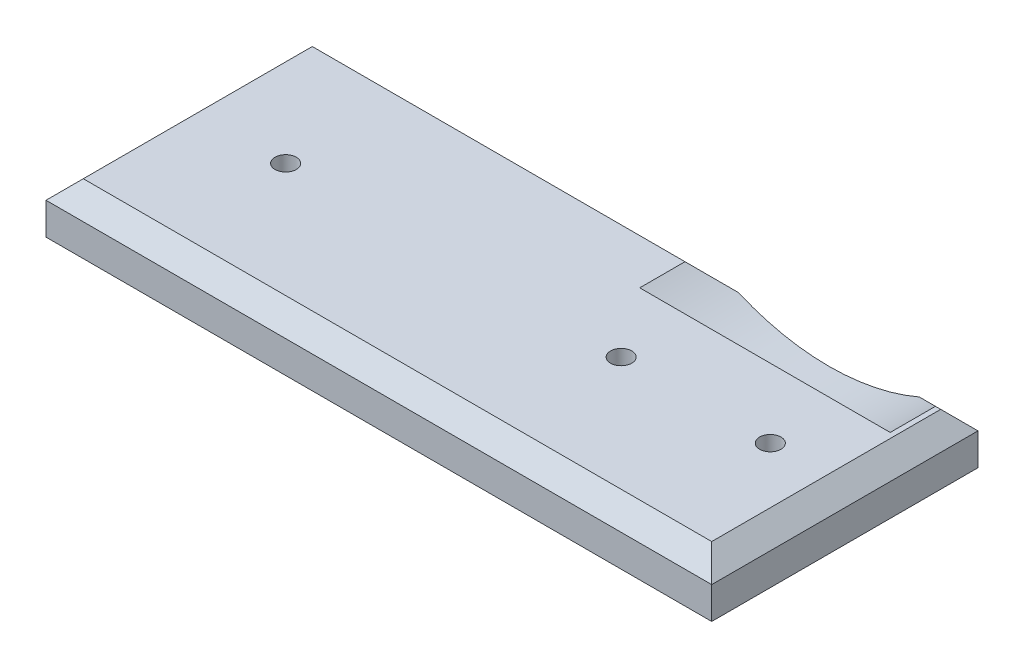
ISO-10303-21;
HEADER;
FILE_DESCRIPTION(('STEP AP214'),'2;1');
FILE_NAME('part.step','',(''),(''),'','','');
FILE_SCHEMA(('AUTOMOTIVE_DESIGN { 1 0 10303 214 1 1 1 1 }'));
ENDSEC;
DATA;
#1=APPLICATION_CONTEXT('core data for automotive mechanical design processes');
#2=APPLICATION_PROTOCOL_DEFINITION('international standard','automotive_design',2000,#1);
#3=PRODUCT_CONTEXT('',#1,'mechanical');
#4=PRODUCT('Part','Part','',(#3));
#5=PRODUCT_RELATED_PRODUCT_CATEGORY('part','',(#4));
#6=PRODUCT_DEFINITION_FORMATION('','',#4);
#7=PRODUCT_DEFINITION_CONTEXT('part definition',#1,'design');
#8=PRODUCT_DEFINITION('design','',#6,#7);
#9=PRODUCT_DEFINITION_SHAPE('','',#8);
#10=(LENGTH_UNIT() NAMED_UNIT(*) SI_UNIT(.MILLI.,.METRE.));
#11=(NAMED_UNIT(*) PLANE_ANGLE_UNIT() SI_UNIT($,.RADIAN.));
#12=(NAMED_UNIT(*) SI_UNIT($,.STERADIAN.) SOLID_ANGLE_UNIT());
#13=UNCERTAINTY_MEASURE_WITH_UNIT(LENGTH_MEASURE(1.E-05),#10,'distance_accuracy_value','');
#14=(GEOMETRIC_REPRESENTATION_CONTEXT(3) GLOBAL_UNCERTAINTY_ASSIGNED_CONTEXT((#13)) GLOBAL_UNIT_ASSIGNED_CONTEXT((#10,
#11,#12)) REPRESENTATION_CONTEXT('',''));
#15=CARTESIAN_POINT('',(0.,0.,0.));
#16=DIRECTION('',(0.,0.,1.));
#17=DIRECTION('',(1.,0.,0.));
#18=AXIS2_PLACEMENT_3D('',#15,#16,#17);
#19=CARTESIAN_POINT('',(0.,9.5,-21.5));
#20=DIRECTION('',(0.,0.707106781186546,-0.707106781186549));
#21=DIRECTION('',(1.,0.,0.));
#22=AXIS2_PLACEMENT_3D('',#19,#20,#21);
#23=PLANE('',#22);
#24=CARTESIAN_POINT('',(34.5,45.5,14.4999999999998));
#25=DIRECTION('',(0.,0.707106781186546,-0.707106781186549));
#26=DIRECTION('',(0.,-0.707106781186549,-0.707106781186546));
#27=AXIS2_PLACEMENT_3D('',#24,#25,#26);
#28=ELLIPSE('',#27,60.811183182043,43.);
#29=CARTESIAN_POINT('',(17.5073545320336,6.00000000000001,-25.));
#30=VERTEX_POINT('',#29);
#31=CARTESIAN_POINT('',(10.9840479673903,9.5,-21.5));
#32=VERTEX_POINT('',#31);
#33=EDGE_CURVE('E52',#30,#32,#28,.T.);
#34=ORIENTED_EDGE('',*,*,#33,.F.);
#35=DIRECTION('',(1.,0.,0.));
#36=VECTOR('',#35,1.);
#37=CARTESIAN_POINT('',(62.5,6.00000000000001,-25.));
#38=LINE('',#37,#36);
#39=CARTESIAN_POINT('',(-62.5,6.00000000000001,-25.));
#40=VERTEX_POINT('',#39);
#41=EDGE_CURVE('E131',#40,#30,#38,.T.);
#42=ORIENTED_EDGE('',*,*,#41,.F.);
#43=DIRECTION('',(0.577350269189625,0.577350269189627,0.577350269189625));
#44=VECTOR('',#43,1.);
#45=CARTESIAN_POINT('',(-39.3333333333334,29.1666666666667,-1.8333333333334));
#46=LINE('',#45,#44);
#47=CARTESIAN_POINT('',(-59.,9.5,-21.5));
#48=VERTEX_POINT('',#47);
#49=EDGE_CURVE('E157',#48,#40,#46,.F.);
#50=ORIENTED_EDGE('',*,*,#49,.F.);
#51=DIRECTION('',(-1.,0.,0.));
#52=VECTOR('',#51,1.);
#53=CARTESIAN_POINT('',(-62.5,9.5,-21.5));
#54=LINE('',#53,#52);
#55=EDGE_CURVE('E207',#32,#48,#54,.T.);
#56=ORIENTED_EDGE('',*,*,#55,.F.);
#57=EDGE_LOOP('',(#34,#42,#50,#56));
#58=FACE_BOUND('',#57,.T.);
#59=ADVANCED_FACE('F42',(#58),#23,.T.);
#60=CARTESIAN_POINT('',(62.5,9.5,-25.));
#61=DIRECTION('',(-1.,0.,0.));
#62=DIRECTION('',(0.,0.,1.));
#63=AXIS2_PLACEMENT_3D('',#60,#61,#62);
#64=PLANE('',#63);
#65=DIRECTION('',(0.,-1.,0.));
#66=VECTOR('',#65,1.);
#67=CARTESIAN_POINT('',(62.5,9.5,-25.));
#68=LINE('',#67,#66);
#69=CARTESIAN_POINT('',(62.5,6.00000000000001,-25.));
#70=VERTEX_POINT('',#69);
#71=CARTESIAN_POINT('',(62.5,0.,-25.));
#72=VERTEX_POINT('',#71);
#73=EDGE_CURVE('E198',#70,#72,#68,.T.);
#74=ORIENTED_EDGE('',*,*,#73,.F.);
#75=DIRECTION('',(0.,0.,1.));
#76=VECTOR('',#75,1.);
#77=CARTESIAN_POINT('',(62.5,6.00000000000001,25.));
#78=LINE('',#77,#76);
#79=CARTESIAN_POINT('',(62.5,6.00000000000001,25.));
#80=VERTEX_POINT('',#79);
#81=EDGE_CURVE('E67',#70,#80,#78,.T.);
#82=ORIENTED_EDGE('',*,*,#81,.T.);
#83=DIRECTION('',(0.,-1.,0.));
#84=VECTOR('',#83,1.);
#85=CARTESIAN_POINT('',(62.5,9.5,25.));
#86=LINE('',#85,#84);
#87=CARTESIAN_POINT('',(62.5,0.,25.));
#88=VERTEX_POINT('',#87);
#89=EDGE_CURVE('E189',#80,#88,#86,.T.);
#90=ORIENTED_EDGE('',*,*,#89,.T.);
#91=DIRECTION('',(0.,0.,-1.));
#92=VECTOR('',#91,1.);
#93=CARTESIAN_POINT('',(62.5,0.,-25.));
#94=LINE('',#93,#92);
#95=EDGE_CURVE('E166',#88,#72,#94,.T.);
#96=ORIENTED_EDGE('',*,*,#95,.T.);
#97=EDGE_LOOP('',(#74,#82,#90,#96));
#98=FACE_BOUND('',#97,.T.);
#99=ADVANCED_FACE('F305',(#98),#64,.F.);
#100=CARTESIAN_POINT('',(-62.5,9.5,-25.));
#101=DIRECTION('',(0.,0.,1.));
#102=DIRECTION('',(1.,0.,0.));
#103=AXIS2_PLACEMENT_3D('',#100,#101,#102);
#104=PLANE('',#103);
#105=ORIENTED_EDGE('',*,*,#41,.T.);
#106=CARTESIAN_POINT('',(34.5,45.5,-25.));
#107=DIRECTION('',(0.,0.,-1.));
#108=DIRECTION('',(-1.,0.,0.));
#109=AXIS2_PLACEMENT_3D('',#106,#107,#108);
#110=CIRCLE('',#109,43.);
#111=CARTESIAN_POINT('',(51.4926454679664,6.00000000000001,-25.));
#112=VERTEX_POINT('',#111);
#113=EDGE_CURVE('E117',#112,#30,#110,.T.);
#114=ORIENTED_EDGE('',*,*,#113,.F.);
#115=EDGE_CURVE('E128',#112,#70,#38,.T.);
#116=ORIENTED_EDGE('',*,*,#115,.T.);
#117=ORIENTED_EDGE('',*,*,#73,.T.);
#118=DIRECTION('',(-1.,0.,0.));
#119=VECTOR('',#118,1.);
#120=CARTESIAN_POINT('',(-62.5,0.,-25.));
#121=LINE('',#120,#119);
#122=CARTESIAN_POINT('',(-62.5,0.,-25.));
#123=VERTEX_POINT('',#122);
#124=EDGE_CURVE('E170',#72,#123,#121,.T.);
#125=ORIENTED_EDGE('',*,*,#124,.T.);
#126=DIRECTION('',(0.,-1.,0.));
#127=VECTOR('',#126,1.);
#128=CARTESIAN_POINT('',(-62.5,9.5,-25.));
#129=LINE('',#128,#127);
#130=EDGE_CURVE('E195',#40,#123,#129,.T.);
#131=ORIENTED_EDGE('',*,*,#130,.F.);
#132=EDGE_LOOP('',(#105,#114,#116,#117,#125,#131));
#133=FACE_BOUND('',#132,.T.);
#134=ADVANCED_FACE('F127',(#133),#104,.F.);
#135=CARTESIAN_POINT('',(-62.5,9.5,-25.));
#136=DIRECTION('',(1.,0.,0.));
#137=DIRECTION('',(0.,0.,-1.));
#138=AXIS2_PLACEMENT_3D('',#135,#136,#137);
#139=PLANE('',#138);
#140=DIRECTION('',(0.,-1.,0.));
#141=VECTOR('',#140,1.);
#142=CARTESIAN_POINT('',(-62.5,9.5,25.));
#143=LINE('',#142,#141);
#144=CARTESIAN_POINT('',(-62.5,6.00000000000001,25.));
#145=VERTEX_POINT('',#144);
#146=CARTESIAN_POINT('',(-62.5,0.,25.));
#147=VERTEX_POINT('',#146);
#148=EDGE_CURVE('E192',#145,#147,#143,.T.);
#149=ORIENTED_EDGE('',*,*,#148,.F.);
#150=DIRECTION('',(0.,0.,-1.));
#151=VECTOR('',#150,1.);
#152=CARTESIAN_POINT('',(-62.5,6.00000000000001,-25.));
#153=LINE('',#152,#151);
#154=EDGE_CURVE('E140',#145,#40,#153,.T.);
#155=ORIENTED_EDGE('',*,*,#154,.T.);
#156=ORIENTED_EDGE('',*,*,#130,.T.);
#157=DIRECTION('',(0.,0.,1.));
#158=VECTOR('',#157,1.);
#159=CARTESIAN_POINT('',(-62.5,0.,-25.));
#160=LINE('',#159,#158);
#161=EDGE_CURVE('E176',#123,#147,#160,.T.);
#162=ORIENTED_EDGE('',*,*,#161,.T.);
#163=EDGE_LOOP('',(#149,#155,#156,#162));
#164=FACE_BOUND('',#163,.T.);
#165=ADVANCED_FACE('F334',(#164),#139,.F.);
#166=CARTESIAN_POINT('',(-62.5,9.5,25.));
#167=DIRECTION('',(0.,0.,-1.));
#168=DIRECTION('',(-1.,0.,0.));
#169=AXIS2_PLACEMENT_3D('',#166,#167,#168);
#170=PLANE('',#169);
#171=ORIENTED_EDGE('',*,*,#89,.F.);
#172=DIRECTION('',(-1.,0.,0.));
#173=VECTOR('',#172,1.);
#174=CARTESIAN_POINT('',(-62.5,6.00000000000001,25.));
#175=LINE('',#174,#173);
#176=EDGE_CURVE('E124',#80,#145,#175,.T.);
#177=ORIENTED_EDGE('',*,*,#176,.T.);
#178=ORIENTED_EDGE('',*,*,#148,.T.);
#179=DIRECTION('',(1.,0.,0.));
#180=VECTOR('',#179,1.);
#181=CARTESIAN_POINT('',(-62.5,0.,25.));
#182=LINE('',#181,#180);
#183=EDGE_CURVE('E185',#147,#88,#182,.T.);
#184=ORIENTED_EDGE('',*,*,#183,.T.);
#185=EDGE_LOOP('',(#171,#177,#178,#184));
#186=FACE_BOUND('',#185,.T.);
#187=ADVANCED_FACE('F327',(#186),#170,.F.);
#188=CARTESIAN_POINT('',(0.,9.5,0.));
#189=DIRECTION('',(0.,1.,0.));
#190=DIRECTION('',(0.,0.,1.));
#191=AXIS2_PLACEMENT_3D('',#188,#189,#190);
#192=PLANE('',#191);
#193=DIRECTION('',(0.,0.,-1.));
#194=VECTOR('',#193,1.);
#195=CARTESIAN_POINT('',(58.0159520326097,9.5,-13.));
#196=LINE('',#195,#194);
#197=CARTESIAN_POINT('',(58.0159520326097,9.5,-13.));
#198=VERTEX_POINT('',#197);
#199=CARTESIAN_POINT('',(58.0159520326097,9.5,-21.5));
#200=VERTEX_POINT('',#199);
#201=EDGE_CURVE('E59',#198,#200,#196,.T.);
#202=ORIENTED_EDGE('',*,*,#201,.F.);
#203=DIRECTION('',(-1.,0.,0.));
#204=VECTOR('',#203,1.);
#205=CARTESIAN_POINT('',(0.,9.5,-13.));
#206=LINE('',#205,#204);
#207=CARTESIAN_POINT('',(10.9840479673903,9.5,-13.));
#208=VERTEX_POINT('',#207);
#209=EDGE_CURVE('E11',#198,#208,#206,.T.);
#210=ORIENTED_EDGE('',*,*,#209,.T.);
#211=DIRECTION('',(0.,0.,-1.));
#212=VECTOR('',#211,1.);
#213=CARTESIAN_POINT('',(10.9840479673903,9.5,-13.));
#214=LINE('',#213,#212);
#215=EDGE_CURVE('E232',#32,#208,#214,.F.);
#216=ORIENTED_EDGE('',*,*,#215,.F.);
#217=ORIENTED_EDGE('',*,*,#55,.T.);
#218=DIRECTION('',(0.,0.,1.));
#219=VECTOR('',#218,1.);
#220=CARTESIAN_POINT('',(-59.,9.5,25.));
#221=LINE('',#220,#219);
#222=CARTESIAN_POINT('',(-59.,9.5,21.5));
#223=VERTEX_POINT('',#222);
#224=EDGE_CURVE('E146',#48,#223,#221,.T.);
#225=ORIENTED_EDGE('',*,*,#224,.T.);
#226=DIRECTION('',(1.,0.,0.));
#227=VECTOR('',#226,1.);
#228=CARTESIAN_POINT('',(62.5,9.5,21.5));
#229=LINE('',#228,#227);
#230=CARTESIAN_POINT('',(59.,9.5,21.5));
#231=VERTEX_POINT('',#230);
#232=EDGE_CURVE('E201',#223,#231,#229,.T.);
#233=ORIENTED_EDGE('',*,*,#232,.T.);
#234=DIRECTION('',(0.,0.,-1.));
#235=VECTOR('',#234,1.);
#236=CARTESIAN_POINT('',(59.,9.5,-25.));
#237=LINE('',#236,#235);
#238=CARTESIAN_POINT('',(59.,9.5,-21.5));
#239=VERTEX_POINT('',#238);
#240=EDGE_CURVE('E204',#231,#239,#237,.T.);
#241=ORIENTED_EDGE('',*,*,#240,.T.);
#242=EDGE_CURVE('E208',#239,#200,#54,.T.);
#243=ORIENTED_EDGE('',*,*,#242,.T.);
#244=EDGE_LOOP('',(#202,#210,#216,#217,#225,#233,#241,#243));
#245=FACE_BOUND('',#244,.T.);
#246=CARTESIAN_POINT('',(-42.5,9.5,0.));
#247=DIRECTION('',(0.,-1.,0.));
#248=DIRECTION('',(0.,0.,-1.));
#249=AXIS2_PLACEMENT_3D('',#246,#247,#248);
#250=CIRCLE('',#249,2.);
#251=CARTESIAN_POINT('',(-42.5,9.5,-2.));
#252=VERTEX_POINT('',#251);
#253=EDGE_CURVE('E242',#252,#252,#250,.T.);
#254=ORIENTED_EDGE('',*,*,#253,.T.);
#255=EDGE_LOOP('',(#254));
#256=FACE_BOUND('',#255,.T.);
#257=CARTESIAN_POINT('',(20.5,9.5,0.));
#258=DIRECTION('',(0.,-1.,0.));
#259=DIRECTION('',(0.,0.,-1.));
#260=AXIS2_PLACEMENT_3D('',#257,#258,#259);
#261=CIRCLE('',#260,2.);
#262=CARTESIAN_POINT('',(20.5,9.5,-2.));
#263=VERTEX_POINT('',#262);
#264=EDGE_CURVE('E254',#263,#263,#261,.T.);
#265=ORIENTED_EDGE('',*,*,#264,.T.);
#266=EDGE_LOOP('',(#265));
#267=FACE_BOUND('',#266,.T.);
#268=CARTESIAN_POINT('',(48.5,9.5,0.));
#269=DIRECTION('',(0.,-1.,0.));
#270=DIRECTION('',(0.,0.,-1.));
#271=AXIS2_PLACEMENT_3D('',#268,#269,#270);
#272=CIRCLE('',#271,2.);
#273=CARTESIAN_POINT('',(48.5,9.5,-2.));
#274=VERTEX_POINT('',#273);
#275=EDGE_CURVE('E237',#274,#274,#272,.T.);
#276=ORIENTED_EDGE('',*,*,#275,.T.);
#277=EDGE_LOOP('',(#276));
#278=FACE_BOUND('',#277,.T.);
#279=ADVANCED_FACE('F215',(#245,#256,#267,#278),#192,.T.);
#280=CARTESIAN_POINT('',(0.,0.,0.));
#281=DIRECTION('',(0.,1.,0.));
#282=DIRECTION('',(0.,0.,1.));
#283=AXIS2_PLACEMENT_3D('',#280,#281,#282);
#284=PLANE('',#283);
#285=CARTESIAN_POINT('',(-42.5,0.,0.));
#286=DIRECTION('',(0.,-1.,0.));
#287=DIRECTION('',(0.,0.,-1.));
#288=AXIS2_PLACEMENT_3D('',#285,#286,#287);
#289=CIRCLE('',#288,4.);
#290=CARTESIAN_POINT('',(-42.5,0.,-4.));
#291=VERTEX_POINT('',#290);
#292=EDGE_CURVE('E268',#291,#291,#289,.T.);
#293=ORIENTED_EDGE('',*,*,#292,.F.);
#294=EDGE_LOOP('',(#293));
#295=FACE_BOUND('',#294,.T.);
#296=CARTESIAN_POINT('',(20.5,0.,0.));
#297=DIRECTION('',(0.,-1.,0.));
#298=DIRECTION('',(0.,0.,-1.));
#299=AXIS2_PLACEMENT_3D('',#296,#297,#298);
#300=CIRCLE('',#299,4.);
#301=CARTESIAN_POINT('',(20.5,0.,-4.));
#302=VERTEX_POINT('',#301);
#303=EDGE_CURVE('E272',#302,#302,#300,.T.);
#304=ORIENTED_EDGE('',*,*,#303,.F.);
#305=EDGE_LOOP('',(#304));
#306=FACE_BOUND('',#305,.T.);
#307=CARTESIAN_POINT('',(48.5,0.,0.));
#308=DIRECTION('',(0.,-1.,0.));
#309=DIRECTION('',(0.,0.,-1.));
#310=AXIS2_PLACEMENT_3D('',#307,#308,#309);
#311=CIRCLE('',#310,4.00000000000001);
#312=CARTESIAN_POINT('',(48.5,0.,-4.00000000000001));
#313=VERTEX_POINT('',#312);
#314=EDGE_CURVE('E279',#313,#313,#311,.T.);
#315=ORIENTED_EDGE('',*,*,#314,.F.);
#316=EDGE_LOOP('',(#315));
#317=FACE_BOUND('',#316,.T.);
#318=ORIENTED_EDGE('',*,*,#95,.F.);
#319=ORIENTED_EDGE('',*,*,#183,.F.);
#320=ORIENTED_EDGE('',*,*,#161,.F.);
#321=ORIENTED_EDGE('',*,*,#124,.F.);
#322=EDGE_LOOP('',(#318,#319,#320,#321));
#323=FACE_BOUND('',#322,.T.);
#324=ADVANCED_FACE('F318',(#295,#306,#317,#323),#284,.F.);
#325=CARTESIAN_POINT('',(59.,9.5,0.));
#326=DIRECTION('',(0.707106781186549,0.707106781186546,0.));
#327=DIRECTION('',(0.,0.,1.));
#328=AXIS2_PLACEMENT_3D('',#325,#326,#327);
#329=PLANE('',#328);
#330=DIRECTION('',(-0.577350269189625,0.577350269189627,-0.577350269189625));
#331=VECTOR('',#330,1.);
#332=CARTESIAN_POINT('',(39.3333333333334,29.1666666666667,1.83333333333341));
#333=LINE('',#332,#331);
#334=EDGE_CURVE('E161',#80,#231,#333,.T.);
#335=ORIENTED_EDGE('',*,*,#334,.F.);
#336=ORIENTED_EDGE('',*,*,#81,.F.);
#337=DIRECTION('',(-0.577350269189625,0.577350269189627,0.577350269189625));
#338=VECTOR('',#337,1.);
#339=CARTESIAN_POINT('',(51.8333333333334,16.6666666666667,-14.3333333333334));
#340=LINE('',#339,#338);
#341=EDGE_CURVE('E138',#239,#70,#340,.F.);
#342=ORIENTED_EDGE('',*,*,#341,.F.);
#343=ORIENTED_EDGE('',*,*,#240,.F.);
#344=EDGE_LOOP('',(#335,#336,#342,#343));
#345=FACE_BOUND('',#344,.T.);
#346=ADVANCED_FACE('F45',(#345),#329,.T.);
#347=EDGE_CURVE('E114',#200,#112,#28,.T.);
#348=ORIENTED_EDGE('',*,*,#347,.F.);
#349=ORIENTED_EDGE('',*,*,#242,.F.);
#350=ORIENTED_EDGE('',*,*,#341,.T.);
#351=ORIENTED_EDGE('',*,*,#115,.F.);
#352=EDGE_LOOP('',(#348,#349,#350,#351));
#353=FACE_BOUND('',#352,.T.);
#354=ADVANCED_FACE('F136',(#353),#23,.T.);
#355=CARTESIAN_POINT('',(0.,9.5,21.5));
#356=DIRECTION('',(0.,0.707106781186546,0.707106781186549));
#357=DIRECTION('',(-1.,0.,0.));
#358=AXIS2_PLACEMENT_3D('',#355,#356,#357);
#359=PLANE('',#358);
#360=ORIENTED_EDGE('',*,*,#334,.T.);
#361=ORIENTED_EDGE('',*,*,#232,.F.);
#362=DIRECTION('',(-0.577350269189625,-0.577350269189627,0.577350269189625));
#363=VECTOR('',#362,1.);
#364=CARTESIAN_POINT('',(-39.3333333333334,29.1666666666667,1.83333333333341));
#365=LINE('',#364,#363);
#366=EDGE_CURVE('E154',#145,#223,#365,.F.);
#367=ORIENTED_EDGE('',*,*,#366,.F.);
#368=ORIENTED_EDGE('',*,*,#176,.F.);
#369=EDGE_LOOP('',(#360,#361,#367,#368));
#370=FACE_BOUND('',#369,.T.);
#371=ADVANCED_FACE('F228',(#370),#359,.T.);
#372=CARTESIAN_POINT('',(-59.,9.5,0.));
#373=DIRECTION('',(-0.707106781186549,0.707106781186546,0.));
#374=DIRECTION('',(0.,0.,-1.));
#375=AXIS2_PLACEMENT_3D('',#372,#373,#374);
#376=PLANE('',#375);
#377=ORIENTED_EDGE('',*,*,#49,.T.);
#378=ORIENTED_EDGE('',*,*,#154,.F.);
#379=ORIENTED_EDGE('',*,*,#366,.T.);
#380=ORIENTED_EDGE('',*,*,#224,.F.);
#381=EDGE_LOOP('',(#377,#378,#379,#380));
#382=FACE_BOUND('',#381,.T.);
#383=ADVANCED_FACE('F223',(#382),#376,.T.);
#384=CARTESIAN_POINT('',(48.5,4.,0.));
#385=DIRECTION('',(0.,-1.,0.));
#386=DIRECTION('',(0.,0.,-1.));
#387=AXIS2_PLACEMENT_3D('',#384,#385,#386);
#388=CYLINDRICAL_SURFACE('',#387,4.00000000000001);
#389=CARTESIAN_POINT('',(48.5,4.,0.));
#390=DIRECTION('',(0.,-1.,0.));
#391=DIRECTION('',(0.,0.,-1.));
#392=AXIS2_PLACEMENT_3D('',#389,#390,#391);
#393=CIRCLE('',#392,4.00000000000001);
#394=CARTESIAN_POINT('',(48.5,4.,-4.00000000000001));
#395=VERTEX_POINT('',#394);
#396=EDGE_CURVE('E179',#395,#395,#393,.T.);
#397=ORIENTED_EDGE('',*,*,#396,.F.);
#398=EDGE_LOOP('',(#397));
#399=FACE_BOUND('',#398,.T.);
#400=ORIENTED_EDGE('',*,*,#314,.T.);
#401=EDGE_LOOP('',(#400));
#402=FACE_BOUND('',#401,.T.);
#403=ADVANCED_FACE('F292',(#399,#402),#388,.F.);
#404=CARTESIAN_POINT('',(48.5,4.,0.));
#405=DIRECTION('',(0.,-1.,0.));
#406=DIRECTION('',(0.,0.,-1.));
#407=AXIS2_PLACEMENT_3D('',#404,#405,#406);
#408=PLANE('',#407);
#409=CARTESIAN_POINT('',(48.5,4.,0.));
#410=DIRECTION('',(0.,-1.,0.));
#411=DIRECTION('',(0.,0.,-1.));
#412=AXIS2_PLACEMENT_3D('',#409,#410,#411);
#413=CIRCLE('',#412,2.);
#414=CARTESIAN_POINT('',(48.5,4.,-2.));
#415=VERTEX_POINT('',#414);
#416=EDGE_CURVE('E258',#415,#415,#413,.T.);
#417=ORIENTED_EDGE('',*,*,#416,.F.);
#418=EDGE_LOOP('',(#417));
#419=FACE_BOUND('',#418,.T.);
#420=ORIENTED_EDGE('',*,*,#396,.T.);
#421=EDGE_LOOP('',(#420));
#422=FACE_BOUND('',#421,.T.);
#423=ADVANCED_FACE('F290',(#419,#422),#408,.T.);
#424=CARTESIAN_POINT('',(20.5,4.,0.));
#425=DIRECTION('',(0.,-1.,0.));
#426=DIRECTION('',(0.,0.,-1.));
#427=AXIS2_PLACEMENT_3D('',#424,#425,#426);
#428=CYLINDRICAL_SURFACE('',#427,4.);
#429=CARTESIAN_POINT('',(20.5,4.,0.));
#430=DIRECTION('',(0.,-1.,0.));
#431=DIRECTION('',(0.,0.,-1.));
#432=AXIS2_PLACEMENT_3D('',#429,#430,#431);
#433=CIRCLE('',#432,4.);
#434=CARTESIAN_POINT('',(20.5,4.,-4.));
#435=VERTEX_POINT('',#434);
#436=EDGE_CURVE('E276',#435,#435,#433,.T.);
#437=ORIENTED_EDGE('',*,*,#436,.F.);
#438=EDGE_LOOP('',(#437));
#439=FACE_BOUND('',#438,.T.);
#440=ORIENTED_EDGE('',*,*,#303,.T.);
#441=EDGE_LOOP('',(#440));
#442=FACE_BOUND('',#441,.T.);
#443=ADVANCED_FACE('F299',(#439,#442),#428,.F.);
#444=CARTESIAN_POINT('',(20.5,4.,0.));
#445=DIRECTION('',(0.,-1.,0.));
#446=DIRECTION('',(0.,0.,-1.));
#447=AXIS2_PLACEMENT_3D('',#444,#445,#446);
#448=PLANE('',#447);
#449=CARTESIAN_POINT('',(20.5,4.,0.));
#450=DIRECTION('',(0.,-1.,0.));
#451=DIRECTION('',(0.,0.,-1.));
#452=AXIS2_PLACEMENT_3D('',#449,#450,#451);
#453=CIRCLE('',#452,2.);
#454=CARTESIAN_POINT('',(20.5,4.,-2.));
#455=VERTEX_POINT('',#454);
#456=EDGE_CURVE('E250',#455,#455,#453,.T.);
#457=ORIENTED_EDGE('',*,*,#456,.F.);
#458=EDGE_LOOP('',(#457));
#459=FACE_BOUND('',#458,.T.);
#460=ORIENTED_EDGE('',*,*,#436,.T.);
#461=EDGE_LOOP('',(#460));
#462=FACE_BOUND('',#461,.T.);
#463=ADVANCED_FACE('F413',(#459,#462),#448,.T.);
#464=CARTESIAN_POINT('',(-42.5,4.,0.));
#465=DIRECTION('',(0.,-1.,0.));
#466=DIRECTION('',(0.,0.,-1.));
#467=AXIS2_PLACEMENT_3D('',#464,#465,#466);
#468=CYLINDRICAL_SURFACE('',#467,4.);
#469=CARTESIAN_POINT('',(-42.5,4.,0.));
#470=DIRECTION('',(0.,-1.,0.));
#471=DIRECTION('',(0.,0.,-1.));
#472=AXIS2_PLACEMENT_3D('',#469,#470,#471);
#473=CIRCLE('',#472,4.);
#474=CARTESIAN_POINT('',(-42.5,4.,-4.));
#475=VERTEX_POINT('',#474);
#476=EDGE_CURVE('E158',#475,#475,#473,.T.);
#477=ORIENTED_EDGE('',*,*,#476,.F.);
#478=EDGE_LOOP('',(#477));
#479=FACE_BOUND('',#478,.T.);
#480=ORIENTED_EDGE('',*,*,#292,.T.);
#481=EDGE_LOOP('',(#480));
#482=FACE_BOUND('',#481,.T.);
#483=ADVANCED_FACE('F423',(#479,#482),#468,.F.);
#484=CARTESIAN_POINT('',(-42.5,4.,0.));
#485=DIRECTION('',(0.,-1.,0.));
#486=DIRECTION('',(0.,0.,-1.));
#487=AXIS2_PLACEMENT_3D('',#484,#485,#486);
#488=PLANE('',#487);
#489=CARTESIAN_POINT('',(-42.5,4.,0.));
#490=DIRECTION('',(0.,-1.,0.));
#491=DIRECTION('',(0.,0.,-1.));
#492=AXIS2_PLACEMENT_3D('',#489,#490,#491);
#493=CIRCLE('',#492,2.);
#494=CARTESIAN_POINT('',(-42.5,4.,-2.));
#495=VERTEX_POINT('',#494);
#496=EDGE_CURVE('E246',#495,#495,#493,.T.);
#497=ORIENTED_EDGE('',*,*,#496,.F.);
#498=EDGE_LOOP('',(#497));
#499=FACE_BOUND('',#498,.T.);
#500=ORIENTED_EDGE('',*,*,#476,.T.);
#501=EDGE_LOOP('',(#500));
#502=FACE_BOUND('',#501,.T.);
#503=ADVANCED_FACE('F432',(#499,#502),#488,.T.);
#504=CARTESIAN_POINT('',(48.5,9.5,0.));
#505=DIRECTION('',(0.,-1.,0.));
#506=DIRECTION('',(0.,0.,-1.));
#507=AXIS2_PLACEMENT_3D('',#504,#505,#506);
#508=CYLINDRICAL_SURFACE('',#507,2.);
#509=ORIENTED_EDGE('',*,*,#275,.F.);
#510=EDGE_LOOP('',(#509));
#511=FACE_BOUND('',#510,.T.);
#512=ORIENTED_EDGE('',*,*,#416,.T.);
#513=EDGE_LOOP('',(#512));
#514=FACE_BOUND('',#513,.T.);
#515=ADVANCED_FACE('F442',(#511,#514),#508,.F.);
#516=CARTESIAN_POINT('',(20.5,9.5,0.));
#517=DIRECTION('',(0.,-1.,0.));
#518=DIRECTION('',(0.,0.,-1.));
#519=AXIS2_PLACEMENT_3D('',#516,#517,#518);
#520=CYLINDRICAL_SURFACE('',#519,2.);
#521=ORIENTED_EDGE('',*,*,#264,.F.);
#522=EDGE_LOOP('',(#521));
#523=FACE_BOUND('',#522,.T.);
#524=ORIENTED_EDGE('',*,*,#456,.T.);
#525=EDGE_LOOP('',(#524));
#526=FACE_BOUND('',#525,.T.);
#527=ADVANCED_FACE('F452',(#523,#526),#520,.F.);
#528=CARTESIAN_POINT('',(-42.5,9.5,0.));
#529=DIRECTION('',(0.,-1.,0.));
#530=DIRECTION('',(0.,0.,-1.));
#531=AXIS2_PLACEMENT_3D('',#528,#529,#530);
#532=CYLINDRICAL_SURFACE('',#531,2.);
#533=ORIENTED_EDGE('',*,*,#253,.F.);
#534=EDGE_LOOP('',(#533));
#535=FACE_BOUND('',#534,.T.);
#536=ORIENTED_EDGE('',*,*,#496,.T.);
#537=EDGE_LOOP('',(#536));
#538=FACE_BOUND('',#537,.T.);
#539=ADVANCED_FACE('F462',(#535,#538),#532,.F.);
#540=CARTESIAN_POINT('',(34.5,45.5,-13.));
#541=DIRECTION('',(0.,0.,-1.));
#542=DIRECTION('',(-1.,0.,0.));
#543=AXIS2_PLACEMENT_3D('',#540,#541,#542);
#544=CYLINDRICAL_SURFACE('',#543,43.);
#545=ORIENTED_EDGE('',*,*,#215,.T.);
#546=CARTESIAN_POINT('',(34.5,45.5,-13.));
#547=DIRECTION('',(0.,0.,-1.));
#548=DIRECTION('',(-1.,0.,0.));
#549=AXIS2_PLACEMENT_3D('',#546,#547,#548);
#550=CIRCLE('',#549,43.);
#551=EDGE_CURVE('E133',#198,#208,#550,.T.);
#552=ORIENTED_EDGE('',*,*,#551,.F.);
#553=ORIENTED_EDGE('',*,*,#201,.T.);
#554=ORIENTED_EDGE('',*,*,#347,.T.);
#555=ORIENTED_EDGE('',*,*,#113,.T.);
#556=ORIENTED_EDGE('',*,*,#33,.T.);
#557=EDGE_LOOP('',(#545,#552,#553,#554,#555,#556));
#558=FACE_BOUND('',#557,.T.);
#559=ADVANCED_FACE('F116',(#558),#544,.F.);
#560=CARTESIAN_POINT('',(34.5,45.5,-13.));
#561=DIRECTION('',(0.,0.,-1.));
#562=DIRECTION('',(-1.,0.,0.));
#563=AXIS2_PLACEMENT_3D('',#560,#561,#562);
#564=PLANE('',#563);
#565=ORIENTED_EDGE('',*,*,#551,.T.);
#566=ORIENTED_EDGE('',*,*,#209,.F.);
#567=EDGE_LOOP('',(#565,#566));
#568=FACE_BOUND('',#567,.T.);
#569=ADVANCED_FACE('F485',(#568),#564,.T.);
#570=CLOSED_SHELL('',(#59,#99,#134,#165,#187,#279,#324,#346,#354,#371,#383,#403,#423,#443,#463,
#483,#503,#515,#527,#539,#559,#569));
#571=MANIFOLD_SOLID_BREP('B2',#570);
#572=ADVANCED_BREP_SHAPE_REPRESENTATION('',(#18,#571),#14);
#573=SHAPE_DEFINITION_REPRESENTATION(#9,#572);
ENDSEC;
END-ISO-10303-21;
